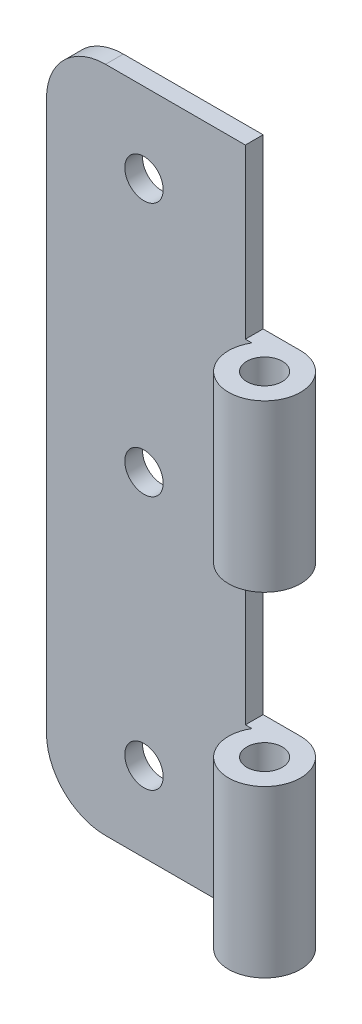
ISO-10303-21;
HEADER;
FILE_DESCRIPTION(('STEP AP214'),'2;1');
FILE_NAME('part.step','',(''),(''),'','','');
FILE_SCHEMA(('AUTOMOTIVE_DESIGN { 1 0 10303 214 1 1 1 1 }'));
ENDSEC;
DATA;
#1=APPLICATION_CONTEXT('core data for automotive mechanical design processes');
#2=APPLICATION_PROTOCOL_DEFINITION('international standard','automotive_design',2000,#1);
#3=PRODUCT_CONTEXT('',#1,'mechanical');
#4=PRODUCT('Part','Part','',(#3));
#5=PRODUCT_RELATED_PRODUCT_CATEGORY('part','',(#4));
#6=PRODUCT_DEFINITION_FORMATION('','',#4);
#7=PRODUCT_DEFINITION_CONTEXT('part definition',#1,'design');
#8=PRODUCT_DEFINITION('design','',#6,#7);
#9=PRODUCT_DEFINITION_SHAPE('','',#8);
#10=(LENGTH_UNIT() NAMED_UNIT(*) SI_UNIT(.MILLI.,.METRE.));
#11=(NAMED_UNIT(*) PLANE_ANGLE_UNIT() SI_UNIT($,.RADIAN.));
#12=(NAMED_UNIT(*) SI_UNIT($,.STERADIAN.) SOLID_ANGLE_UNIT());
#13=UNCERTAINTY_MEASURE_WITH_UNIT(LENGTH_MEASURE(1.E-05),#10,'distance_accuracy_value','');
#14=(GEOMETRIC_REPRESENTATION_CONTEXT(3) GLOBAL_UNCERTAINTY_ASSIGNED_CONTEXT((#13)) GLOBAL_UNIT_ASSIGNED_CONTEXT((#10,
#11,#12)) REPRESENTATION_CONTEXT('',''));
#15=CARTESIAN_POINT('',(0.,0.,0.));
#16=DIRECTION('',(0.,0.,1.));
#17=DIRECTION('',(1.,0.,0.));
#18=AXIS2_PLACEMENT_3D('',#15,#16,#17);
#19=CARTESIAN_POINT('',(0.,-56.5,0.));
#20=DIRECTION('',(0.,1.,0.));
#21=DIRECTION('',(0.,0.,1.));
#22=AXIS2_PLACEMENT_3D('',#19,#20,#21);
#23=CYLINDRICAL_SURFACE('',#22,3.);
#24=CARTESIAN_POINT('',(0.,-28.45,0.));
#25=DIRECTION('',(0.,1.,0.));
#26=DIRECTION('',(0.,0.,1.));
#27=AXIS2_PLACEMENT_3D('',#24,#25,#26);
#28=CIRCLE('',#27,3.);
#29=CARTESIAN_POINT('',(0.,-28.45,3.));
#30=VERTEX_POINT('',#29);
#31=EDGE_CURVE('E184',#30,#30,#28,.T.);
#32=ORIENTED_EDGE('',*,*,#31,.T.);
#33=EDGE_LOOP('',(#32));
#34=FACE_BOUND('',#33,.T.);
#35=CARTESIAN_POINT('',(0.,-56.5,0.));
#36=DIRECTION('',(0.,1.,0.));
#37=DIRECTION('',(0.,0.,1.));
#38=AXIS2_PLACEMENT_3D('',#35,#36,#37);
#39=CIRCLE('',#38,3.);
#40=CARTESIAN_POINT('',(0.,-56.5,3.));
#41=VERTEX_POINT('',#40);
#42=EDGE_CURVE('E192',#41,#41,#39,.F.);
#43=ORIENTED_EDGE('',*,*,#42,.T.);
#44=EDGE_LOOP('',(#43));
#45=FACE_BOUND('',#44,.T.);
#46=ADVANCED_FACE('F16',(#34,#45),#23,.F.);
#47=CARTESIAN_POINT('',(0.,-56.5,0.));
#48=DIRECTION('',(0.,1.,0.));
#49=DIRECTION('',(0.,0.,1.));
#50=AXIS2_PLACEMENT_3D('',#47,#48,#49);
#51=CYLINDRICAL_SURFACE('',#50,3.);
#52=CARTESIAN_POINT('',(0.,28.05,0.));
#53=DIRECTION('',(0.,1.,0.));
#54=DIRECTION('',(0.,0.,1.));
#55=AXIS2_PLACEMENT_3D('',#52,#53,#54);
#56=CIRCLE('',#55,3.);
#57=CARTESIAN_POINT('',(0.,28.05,3.));
#58=VERTEX_POINT('',#57);
#59=EDGE_CURVE('E173',#58,#58,#56,.T.);
#60=ORIENTED_EDGE('',*,*,#59,.T.);
#61=EDGE_LOOP('',(#60));
#62=FACE_BOUND('',#61,.T.);
#63=CARTESIAN_POINT('',(0.,0.,0.));
#64=DIRECTION('',(0.,1.,0.));
#65=DIRECTION('',(0.,0.,1.));
#66=AXIS2_PLACEMENT_3D('',#63,#64,#65);
#67=CIRCLE('',#66,3.);
#68=CARTESIAN_POINT('',(0.,0.,3.));
#69=VERTEX_POINT('',#68);
#70=EDGE_CURVE('E180',#69,#69,#67,.F.);
#71=ORIENTED_EDGE('',*,*,#70,.T.);
#72=EDGE_LOOP('',(#71));
#73=FACE_BOUND('',#72,.T.);
#74=ADVANCED_FACE('F331',(#62,#73),#51,.F.);
#75=CARTESIAN_POINT('',(-30.,46.5,-3.1));
#76=DIRECTION('',(0.,0.,1.));
#77=DIRECTION('',(1.,0.,0.));
#78=AXIS2_PLACEMENT_3D('',#75,#76,#77);
#79=PLANE('',#78);
#80=CARTESIAN_POINT('',(-23.5,0.,-3.1));
#81=DIRECTION('',(0.,0.,-1.));
#82=DIRECTION('',(-1.,0.,0.));
#83=AXIS2_PLACEMENT_3D('',#80,#81,#82);
#84=CIRCLE('',#83,3.25);
#85=CARTESIAN_POINT('',(-26.75,0.,-3.1));
#86=VERTEX_POINT('',#85);
#87=EDGE_CURVE('E168',#86,#86,#84,.T.);
#88=ORIENTED_EDGE('',*,*,#87,.T.);
#89=EDGE_LOOP('',(#88));
#90=FACE_BOUND('',#89,.T.);
#91=CARTESIAN_POINT('',(-23.5,43.,-3.1));
#92=DIRECTION('',(0.,0.,-1.));
#93=DIRECTION('',(-1.,0.,0.));
#94=AXIS2_PLACEMENT_3D('',#91,#92,#93);
#95=CIRCLE('',#94,3.25);
#96=CARTESIAN_POINT('',(-26.75,43.,-3.1));
#97=VERTEX_POINT('',#96);
#98=EDGE_CURVE('E131',#97,#97,#95,.T.);
#99=ORIENTED_EDGE('',*,*,#98,.T.);
#100=EDGE_LOOP('',(#99));
#101=FACE_BOUND('',#100,.T.);
#102=DIRECTION('',(0.,1.,0.));
#103=VECTOR('',#102,1.);
#104=CARTESIAN_POINT('',(-5.25357021462548,-56.5,-3.1));
#105=LINE('',#104,#103);
#106=CARTESIAN_POINT('',(-5.25357021462548,28.05,-3.1));
#107=VERTEX_POINT('',#106);
#108=CARTESIAN_POINT('',(-5.25357021462548,0.,-3.1));
#109=VERTEX_POINT('',#108);
#110=EDGE_CURVE('E140',#107,#109,#105,.F.);
#111=ORIENTED_EDGE('',*,*,#110,.F.);
#112=DIRECTION('',(1.,0.,0.));
#113=VECTOR('',#112,1.);
#114=CARTESIAN_POINT('',(6.1,28.05,-3.10000000000001));
#115=LINE('',#114,#113);
#116=CARTESIAN_POINT('',(-6.35,28.05,-3.10000000000001));
#117=VERTEX_POINT('',#116);
#118=EDGE_CURVE('E176',#107,#117,#115,.F.);
#119=ORIENTED_EDGE('',*,*,#118,.T.);
#120=DIRECTION('',(0.,-1.,0.));
#121=VECTOR('',#120,1.);
#122=CARTESIAN_POINT('',(-6.35,28.05,-3.10000000000001));
#123=LINE('',#122,#121);
#124=CARTESIAN_POINT('',(-6.35,56.5,-3.10000000000001));
#125=VERTEX_POINT('',#124);
#126=EDGE_CURVE('E134',#117,#125,#123,.F.);
#127=ORIENTED_EDGE('',*,*,#126,.T.);
#128=DIRECTION('',(1.,0.,0.));
#129=VECTOR('',#128,1.);
#130=CARTESIAN_POINT('',(0.,56.5,-3.10000000000001));
#131=LINE('',#130,#129);
#132=CARTESIAN_POINT('',(-30.,56.5,-3.1));
#133=VERTEX_POINT('',#132);
#134=EDGE_CURVE('E110',#125,#133,#131,.F.);
#135=ORIENTED_EDGE('',*,*,#134,.T.);
#136=CARTESIAN_POINT('',(-30.,46.5,-3.1));
#137=DIRECTION('',(0.,0.,1.));
#138=DIRECTION('',(1.,0.,0.));
#139=AXIS2_PLACEMENT_3D('',#136,#137,#138);
#140=CIRCLE('',#139,10.);
#141=CARTESIAN_POINT('',(-40.,46.5,-3.1));
#142=VERTEX_POINT('',#141);
#143=EDGE_CURVE('E104',#142,#133,#140,.F.);
#144=ORIENTED_EDGE('',*,*,#143,.F.);
#145=DIRECTION('',(0.,1.,0.));
#146=VECTOR('',#145,1.);
#147=CARTESIAN_POINT('',(-40.,46.5,-3.1));
#148=LINE('',#147,#146);
#149=CARTESIAN_POINT('',(-40.,-46.5,-3.1));
#150=VERTEX_POINT('',#149);
#151=EDGE_CURVE('E108',#142,#150,#148,.F.);
#152=ORIENTED_EDGE('',*,*,#151,.T.);
#153=CARTESIAN_POINT('',(-30.,-46.5,-3.1));
#154=DIRECTION('',(0.,0.,1.));
#155=DIRECTION('',(1.,0.,0.));
#156=AXIS2_PLACEMENT_3D('',#153,#154,#155);
#157=CIRCLE('',#156,10.);
#158=CARTESIAN_POINT('',(-30.,-56.5,-3.1));
#159=VERTEX_POINT('',#158);
#160=EDGE_CURVE('E121',#159,#150,#157,.F.);
#161=ORIENTED_EDGE('',*,*,#160,.F.);
#162=DIRECTION('',(1.,0.,0.));
#163=VECTOR('',#162,1.);
#164=CARTESIAN_POINT('',(6.1,-56.5,-3.1));
#165=LINE('',#164,#163);
#166=CARTESIAN_POINT('',(-5.25357021462548,-56.5,-3.1));
#167=VERTEX_POINT('',#166);
#168=EDGE_CURVE('E191',#159,#167,#165,.T.);
#169=ORIENTED_EDGE('',*,*,#168,.T.);
#170=DIRECTION('',(0.,1.,0.));
#171=VECTOR('',#170,1.);
#172=CARTESIAN_POINT('',(-5.25357021462548,-56.5,-3.1));
#173=LINE('',#172,#171);
#174=CARTESIAN_POINT('',(-5.25357021462548,-28.45,-3.1));
#175=VERTEX_POINT('',#174);
#176=EDGE_CURVE('E151',#175,#167,#173,.F.);
#177=ORIENTED_EDGE('',*,*,#176,.F.);
#178=DIRECTION('',(1.,0.,0.));
#179=VECTOR('',#178,1.);
#180=CARTESIAN_POINT('',(6.1,-28.45,-3.10000000000001));
#181=LINE('',#180,#179);
#182=CARTESIAN_POINT('',(-6.35,-28.45,-3.10000000000001));
#183=VERTEX_POINT('',#182);
#184=EDGE_CURVE('E187',#175,#183,#181,.F.);
#185=ORIENTED_EDGE('',*,*,#184,.T.);
#186=DIRECTION('',(0.,1.,0.));
#187=VECTOR('',#186,1.);
#188=CARTESIAN_POINT('',(-6.35,-28.45,-3.10000000000001));
#189=LINE('',#188,#187);
#190=CARTESIAN_POINT('',(-6.35,0.,-3.10000000000001));
#191=VERTEX_POINT('',#190);
#192=EDGE_CURVE('E145',#183,#191,#189,.T.);
#193=ORIENTED_EDGE('',*,*,#192,.T.);
#194=DIRECTION('',(1.,0.,0.));
#195=VECTOR('',#194,1.);
#196=CARTESIAN_POINT('',(-6.35,0.,-3.10000000000001));
#197=LINE('',#196,#195);
#198=EDGE_CURVE('E183',#191,#109,#197,.T.);
#199=ORIENTED_EDGE('',*,*,#198,.T.);
#200=EDGE_LOOP('',(#111,#119,#127,#135,#144,#152,#161,#169,#177,#185,#193,#199));
#201=FACE_BOUND('',#200,.T.);
#202=CARTESIAN_POINT('',(-23.5,-43.,-3.1));
#203=DIRECTION('',(0.,0.,-1.));
#204=DIRECTION('',(-1.,0.,0.));
#205=AXIS2_PLACEMENT_3D('',#202,#203,#204);
#206=CIRCLE('',#205,3.25);
#207=CARTESIAN_POINT('',(-26.75,-43.,-3.1));
#208=VERTEX_POINT('',#207);
#209=EDGE_CURVE('E19',#208,#208,#206,.T.);
#210=ORIENTED_EDGE('',*,*,#209,.T.);
#211=EDGE_LOOP('',(#210));
#212=FACE_BOUND('',#211,.T.);
#213=ADVANCED_FACE('F106',(#90,#101,#201,#212),#79,.T.);
#214=CARTESIAN_POINT('',(-23.5,-43.,-3.1));
#215=DIRECTION('',(0.,0.,-1.));
#216=DIRECTION('',(-1.,0.,0.));
#217=AXIS2_PLACEMENT_3D('',#214,#215,#216);
#218=CYLINDRICAL_SURFACE('',#217,3.25);
#219=CARTESIAN_POINT('',(-23.5,-43.,-6.1));
#220=DIRECTION('',(0.,0.,-1.));
#221=DIRECTION('',(-1.,0.,0.));
#222=AXIS2_PLACEMENT_3D('',#219,#220,#221);
#223=CIRCLE('',#222,3.25);
#224=CARTESIAN_POINT('',(-26.75,-43.,-6.1));
#225=VERTEX_POINT('',#224);
#226=EDGE_CURVE('E165',#225,#225,#223,.T.);
#227=ORIENTED_EDGE('',*,*,#226,.T.);
#228=EDGE_LOOP('',(#227));
#229=FACE_BOUND('',#228,.T.);
#230=ORIENTED_EDGE('',*,*,#209,.F.);
#231=EDGE_LOOP('',(#230));
#232=FACE_BOUND('',#231,.T.);
#233=ADVANCED_FACE('F330',(#229,#232),#218,.F.);
#234=CARTESIAN_POINT('',(-30.,46.5,-3.1));
#235=DIRECTION('',(0.,0.,1.));
#236=DIRECTION('',(1.,0.,0.));
#237=AXIS2_PLACEMENT_3D('',#234,#235,#236);
#238=CYLINDRICAL_SURFACE('',#237,10.);
#239=ORIENTED_EDGE('',*,*,#143,.T.);
#240=DIRECTION('',(0.,0.,-1.));
#241=VECTOR('',#240,1.);
#242=CARTESIAN_POINT('',(-30.,56.5,0.));
#243=LINE('',#242,#241);
#244=CARTESIAN_POINT('',(-30.,56.5,-6.1));
#245=VERTEX_POINT('',#244);
#246=EDGE_CURVE('E136',#133,#245,#243,.T.);
#247=ORIENTED_EDGE('',*,*,#246,.T.);
#248=CARTESIAN_POINT('',(-30.,46.5,-6.1));
#249=DIRECTION('',(0.,0.,1.));
#250=DIRECTION('',(1.,0.,0.));
#251=AXIS2_PLACEMENT_3D('',#248,#249,#250);
#252=CIRCLE('',#251,10.);
#253=CARTESIAN_POINT('',(-40.,46.5,-6.1));
#254=VERTEX_POINT('',#253);
#255=EDGE_CURVE('E125',#245,#254,#252,.T.);
#256=ORIENTED_EDGE('',*,*,#255,.T.);
#257=DIRECTION('',(0.,0.,-1.));
#258=VECTOR('',#257,1.);
#259=CARTESIAN_POINT('',(-40.,46.5,-3.1));
#260=LINE('',#259,#258);
#261=EDGE_CURVE('E115',#254,#142,#260,.F.);
#262=ORIENTED_EDGE('',*,*,#261,.T.);
#263=EDGE_LOOP('',(#239,#247,#256,#262));
#264=FACE_BOUND('',#263,.T.);
#265=ADVANCED_FACE('F124',(#264),#238,.T.);
#266=CARTESIAN_POINT('',(-40.,46.5,-3.1));
#267=DIRECTION('',(1.,0.,0.));
#268=DIRECTION('',(0.,0.,-1.));
#269=AXIS2_PLACEMENT_3D('',#266,#267,#268);
#270=PLANE('',#269);
#271=DIRECTION('',(0.,0.,1.));
#272=VECTOR('',#271,1.);
#273=CARTESIAN_POINT('',(-40.,-46.5,-3.1));
#274=LINE('',#273,#272);
#275=CARTESIAN_POINT('',(-40.,-46.5,-6.1));
#276=VERTEX_POINT('',#275);
#277=EDGE_CURVE('E120',#150,#276,#274,.F.);
#278=ORIENTED_EDGE('',*,*,#277,.F.);
#279=ORIENTED_EDGE('',*,*,#151,.F.);
#280=ORIENTED_EDGE('',*,*,#261,.F.);
#281=DIRECTION('',(0.,1.,0.));
#282=VECTOR('',#281,1.);
#283=CARTESIAN_POINT('',(-40.,46.5,-6.1));
#284=LINE('',#283,#282);
#285=EDGE_CURVE('E163',#254,#276,#284,.F.);
#286=ORIENTED_EDGE('',*,*,#285,.T.);
#287=EDGE_LOOP('',(#278,#279,#280,#286));
#288=FACE_BOUND('',#287,.T.);
#289=ADVANCED_FACE('F117',(#288),#270,.F.);
#290=CARTESIAN_POINT('',(-30.,-46.5,-3.1));
#291=DIRECTION('',(0.,0.,1.));
#292=DIRECTION('',(1.,0.,0.));
#293=AXIS2_PLACEMENT_3D('',#290,#291,#292);
#294=CYLINDRICAL_SURFACE('',#293,10.);
#295=ORIENTED_EDGE('',*,*,#160,.T.);
#296=ORIENTED_EDGE('',*,*,#277,.T.);
#297=CARTESIAN_POINT('',(-30.,-46.5,-6.1));
#298=DIRECTION('',(0.,0.,1.));
#299=DIRECTION('',(1.,0.,0.));
#300=AXIS2_PLACEMENT_3D('',#297,#298,#299);
#301=CIRCLE('',#300,10.);
#302=CARTESIAN_POINT('',(-30.,-56.5,-6.1));
#303=VERTEX_POINT('',#302);
#304=EDGE_CURVE('E159',#276,#303,#301,.T.);
#305=ORIENTED_EDGE('',*,*,#304,.T.);
#306=DIRECTION('',(0.,0.,1.));
#307=VECTOR('',#306,1.);
#308=CARTESIAN_POINT('',(-30.,-56.5,0.));
#309=LINE('',#308,#307);
#310=EDGE_CURVE('E195',#303,#159,#309,.T.);
#311=ORIENTED_EDGE('',*,*,#310,.T.);
#312=EDGE_LOOP('',(#295,#296,#305,#311));
#313=FACE_BOUND('',#312,.T.);
#314=ADVANCED_FACE('F199',(#313),#294,.T.);
#315=CARTESIAN_POINT('',(6.1,-56.5,0.));
#316=DIRECTION('',(0.,1.,0.));
#317=DIRECTION('',(0.,0.,1.));
#318=AXIS2_PLACEMENT_3D('',#315,#316,#317);
#319=PLANE('',#318);
#320=CARTESIAN_POINT('',(0.,-56.5,0.));
#321=DIRECTION('',(0.,1.,0.));
#322=DIRECTION('',(0.,0.,1.));
#323=AXIS2_PLACEMENT_3D('',#320,#321,#322);
#324=CIRCLE('',#323,6.1);
#325=CARTESIAN_POINT('',(0.,-56.5,-6.1));
#326=VERTEX_POINT('',#325);
#327=EDGE_CURVE('E154',#167,#326,#324,.T.);
#328=ORIENTED_EDGE('',*,*,#327,.F.);
#329=ORIENTED_EDGE('',*,*,#168,.F.);
#330=ORIENTED_EDGE('',*,*,#310,.F.);
#331=DIRECTION('',(1.,0.,0.));
#332=VECTOR('',#331,1.);
#333=CARTESIAN_POINT('',(-30.,-56.5,-6.1));
#334=LINE('',#333,#332);
#335=EDGE_CURVE('E162',#303,#326,#334,.T.);
#336=ORIENTED_EDGE('',*,*,#335,.T.);
#337=EDGE_LOOP('',(#328,#329,#330,#336));
#338=FACE_BOUND('',#337,.T.);
#339=ORIENTED_EDGE('',*,*,#42,.F.);
#340=EDGE_LOOP('',(#339));
#341=FACE_BOUND('',#340,.T.);
#342=ADVANCED_FACE('F270',(#338,#341),#319,.F.);
#343=CARTESIAN_POINT('',(0.,-56.5,0.));
#344=DIRECTION('',(0.,1.,0.));
#345=DIRECTION('',(0.,0.,1.));
#346=AXIS2_PLACEMENT_3D('',#343,#344,#345);
#347=CYLINDRICAL_SURFACE('',#346,6.1);
#348=CARTESIAN_POINT('',(0.,-28.45,0.));
#349=DIRECTION('',(0.,1.,0.));
#350=DIRECTION('',(0.,0.,1.));
#351=AXIS2_PLACEMENT_3D('',#348,#349,#350);
#352=CIRCLE('',#351,6.1);
#353=CARTESIAN_POINT('',(0.,-28.45,-6.1));
#354=VERTEX_POINT('',#353);
#355=EDGE_CURVE('E153',#354,#175,#352,.F.);
#356=ORIENTED_EDGE('',*,*,#355,.T.);
#357=ORIENTED_EDGE('',*,*,#176,.T.);
#358=ORIENTED_EDGE('',*,*,#327,.T.);
#359=DIRECTION('',(0.,1.,0.));
#360=VECTOR('',#359,1.);
#361=CARTESIAN_POINT('',(0.,46.5,-6.1));
#362=LINE('',#361,#360);
#363=EDGE_CURVE('E259',#326,#354,#362,.T.);
#364=ORIENTED_EDGE('',*,*,#363,.T.);
#365=EDGE_LOOP('',(#356,#357,#358,#364));
#366=FACE_BOUND('',#365,.T.);
#367=ADVANCED_FACE('F274',(#366),#347,.T.);
#368=CARTESIAN_POINT('',(6.1,-28.45,113.));
#369=DIRECTION('',(0.,-1.,0.));
#370=DIRECTION('',(1.,0.,0.));
#371=AXIS2_PLACEMENT_3D('',#368,#369,#370);
#372=PLANE('',#371);
#373=ORIENTED_EDGE('',*,*,#31,.F.);
#374=EDGE_LOOP('',(#373));
#375=FACE_BOUND('',#374,.T.);
#376=ORIENTED_EDGE('',*,*,#355,.F.);
#377=DIRECTION('',(1.,0.,0.));
#378=VECTOR('',#377,1.);
#379=CARTESIAN_POINT('',(-30.,-28.45,-6.1));
#380=LINE('',#379,#378);
#381=CARTESIAN_POINT('',(-6.35,-28.45,-6.1));
#382=VERTEX_POINT('',#381);
#383=EDGE_CURVE('E250',#354,#382,#380,.F.);
#384=ORIENTED_EDGE('',*,*,#383,.T.);
#385=DIRECTION('',(0.,0.,1.));
#386=VECTOR('',#385,1.);
#387=CARTESIAN_POINT('',(-6.35,-28.45,113.));
#388=LINE('',#387,#386);
#389=EDGE_CURVE('E148',#382,#183,#388,.T.);
#390=ORIENTED_EDGE('',*,*,#389,.T.);
#391=ORIENTED_EDGE('',*,*,#184,.F.);
#392=EDGE_LOOP('',(#376,#384,#390,#391));
#393=FACE_BOUND('',#392,.T.);
#394=ADVANCED_FACE('F277',(#375,#393),#372,.F.);
#395=CARTESIAN_POINT('',(-6.35,-28.45,113.));
#396=DIRECTION('',(-1.,0.,0.));
#397=DIRECTION('',(0.,0.,1.));
#398=AXIS2_PLACEMENT_3D('',#395,#396,#397);
#399=PLANE('',#398);
#400=ORIENTED_EDGE('',*,*,#389,.F.);
#401=DIRECTION('',(0.,1.,0.));
#402=VECTOR('',#401,1.);
#403=CARTESIAN_POINT('',(-6.35,46.5,-6.1));
#404=LINE('',#403,#402);
#405=CARTESIAN_POINT('',(-6.35,0.,-6.1));
#406=VERTEX_POINT('',#405);
#407=EDGE_CURVE('E238',#382,#406,#404,.T.);
#408=ORIENTED_EDGE('',*,*,#407,.T.);
#409=DIRECTION('',(0.,0.,1.));
#410=VECTOR('',#409,1.);
#411=CARTESIAN_POINT('',(-6.35,0.,113.));
#412=LINE('',#411,#410);
#413=EDGE_CURVE('E147',#406,#191,#412,.T.);
#414=ORIENTED_EDGE('',*,*,#413,.T.);
#415=ORIENTED_EDGE('',*,*,#192,.F.);
#416=EDGE_LOOP('',(#400,#408,#414,#415));
#417=FACE_BOUND('',#416,.T.);
#418=ADVANCED_FACE('F282',(#417),#399,.F.);
#419=CARTESIAN_POINT('',(-6.35,0.,113.));
#420=DIRECTION('',(0.,1.,0.));
#421=DIRECTION('',(0.,0.,1.));
#422=AXIS2_PLACEMENT_3D('',#419,#420,#421);
#423=PLANE('',#422);
#424=ORIENTED_EDGE('',*,*,#70,.F.);
#425=EDGE_LOOP('',(#424));
#426=FACE_BOUND('',#425,.T.);
#427=ORIENTED_EDGE('',*,*,#413,.F.);
#428=DIRECTION('',(1.,0.,0.));
#429=VECTOR('',#428,1.);
#430=CARTESIAN_POINT('',(-30.,0.,-6.1));
#431=LINE('',#430,#429);
#432=CARTESIAN_POINT('',(0.,0.,-6.1));
#433=VERTEX_POINT('',#432);
#434=EDGE_CURVE('E235',#406,#433,#431,.T.);
#435=ORIENTED_EDGE('',*,*,#434,.T.);
#436=CARTESIAN_POINT('',(0.,0.,0.));
#437=DIRECTION('',(0.,1.,0.));
#438=DIRECTION('',(0.,0.,1.));
#439=AXIS2_PLACEMENT_3D('',#436,#437,#438);
#440=CIRCLE('',#439,6.1);
#441=EDGE_CURVE('E144',#109,#433,#440,.T.);
#442=ORIENTED_EDGE('',*,*,#441,.F.);
#443=ORIENTED_EDGE('',*,*,#198,.F.);
#444=EDGE_LOOP('',(#427,#435,#442,#443));
#445=FACE_BOUND('',#444,.T.);
#446=ADVANCED_FACE('F287',(#426,#445),#423,.F.);
#447=CARTESIAN_POINT('',(0.,-56.5,0.));
#448=DIRECTION('',(0.,1.,0.));
#449=DIRECTION('',(0.,0.,1.));
#450=AXIS2_PLACEMENT_3D('',#447,#448,#449);
#451=CYLINDRICAL_SURFACE('',#450,6.1);
#452=CARTESIAN_POINT('',(0.,28.05,0.));
#453=DIRECTION('',(0.,1.,0.));
#454=DIRECTION('',(0.,0.,1.));
#455=AXIS2_PLACEMENT_3D('',#452,#453,#454);
#456=CIRCLE('',#455,6.1);
#457=CARTESIAN_POINT('',(0.,28.05,-6.1));
#458=VERTEX_POINT('',#457);
#459=EDGE_CURVE('E143',#458,#107,#456,.F.);
#460=ORIENTED_EDGE('',*,*,#459,.T.);
#461=ORIENTED_EDGE('',*,*,#110,.T.);
#462=ORIENTED_EDGE('',*,*,#441,.T.);
#463=DIRECTION('',(0.,1.,0.));
#464=VECTOR('',#463,1.);
#465=CARTESIAN_POINT('',(0.,46.5,-6.1));
#466=LINE('',#465,#464);
#467=EDGE_CURVE('E227',#433,#458,#466,.T.);
#468=ORIENTED_EDGE('',*,*,#467,.T.);
#469=EDGE_LOOP('',(#460,#461,#462,#468));
#470=FACE_BOUND('',#469,.T.);
#471=ADVANCED_FACE('F289',(#470),#451,.T.);
#472=CARTESIAN_POINT('',(6.1,28.05,113.));
#473=DIRECTION('',(0.,-1.,0.));
#474=DIRECTION('',(0.,0.,-1.));
#475=AXIS2_PLACEMENT_3D('',#472,#473,#474);
#476=PLANE('',#475);
#477=ORIENTED_EDGE('',*,*,#59,.F.);
#478=EDGE_LOOP('',(#477));
#479=FACE_BOUND('',#478,.T.);
#480=ORIENTED_EDGE('',*,*,#459,.F.);
#481=DIRECTION('',(1.,0.,0.));
#482=VECTOR('',#481,1.);
#483=CARTESIAN_POINT('',(-30.,28.05,-6.1));
#484=LINE('',#483,#482);
#485=CARTESIAN_POINT('',(-6.35,28.05,-6.1));
#486=VERTEX_POINT('',#485);
#487=EDGE_CURVE('E218',#458,#486,#484,.F.);
#488=ORIENTED_EDGE('',*,*,#487,.T.);
#489=DIRECTION('',(0.,0.,1.));
#490=VECTOR('',#489,1.);
#491=CARTESIAN_POINT('',(-6.35,28.05,113.));
#492=LINE('',#491,#490);
#493=EDGE_CURVE('E137',#486,#117,#492,.T.);
#494=ORIENTED_EDGE('',*,*,#493,.T.);
#495=ORIENTED_EDGE('',*,*,#118,.F.);
#496=EDGE_LOOP('',(#480,#488,#494,#495));
#497=FACE_BOUND('',#496,.T.);
#498=ADVANCED_FACE('F292',(#479,#497),#476,.F.);
#499=CARTESIAN_POINT('',(-6.35,28.05,113.));
#500=DIRECTION('',(-1.,0.,0.));
#501=DIRECTION('',(0.,-1.,0.));
#502=AXIS2_PLACEMENT_3D('',#499,#500,#501);
#503=PLANE('',#502);
#504=ORIENTED_EDGE('',*,*,#493,.F.);
#505=DIRECTION('',(0.,1.,0.));
#506=VECTOR('',#505,1.);
#507=CARTESIAN_POINT('',(-6.35,46.5,-6.1));
#508=LINE('',#507,#506);
#509=CARTESIAN_POINT('',(-6.35,56.5,-6.1));
#510=VERTEX_POINT('',#509);
#511=EDGE_CURVE('E215',#486,#510,#508,.T.);
#512=ORIENTED_EDGE('',*,*,#511,.T.);
#513=DIRECTION('',(0.,0.,-1.));
#514=VECTOR('',#513,1.);
#515=CARTESIAN_POINT('',(-6.35,56.5,0.));
#516=LINE('',#515,#514);
#517=EDGE_CURVE('E34',#510,#125,#516,.F.);
#518=ORIENTED_EDGE('',*,*,#517,.T.);
#519=ORIENTED_EDGE('',*,*,#126,.F.);
#520=EDGE_LOOP('',(#504,#512,#518,#519));
#521=FACE_BOUND('',#520,.T.);
#522=ADVANCED_FACE('F296',(#521),#503,.F.);
#523=CARTESIAN_POINT('',(0.,56.5,0.));
#524=DIRECTION('',(0.,-1.,0.));
#525=DIRECTION('',(0.,0.,-1.));
#526=AXIS2_PLACEMENT_3D('',#523,#524,#525);
#527=PLANE('',#526);
#528=ORIENTED_EDGE('',*,*,#517,.F.);
#529=DIRECTION('',(1.,0.,0.));
#530=VECTOR('',#529,1.);
#531=CARTESIAN_POINT('',(-30.,56.5,-6.1));
#532=LINE('',#531,#530);
#533=EDGE_CURVE('E158',#510,#245,#532,.F.);
#534=ORIENTED_EDGE('',*,*,#533,.T.);
#535=ORIENTED_EDGE('',*,*,#246,.F.);
#536=ORIENTED_EDGE('',*,*,#134,.F.);
#537=EDGE_LOOP('',(#528,#534,#535,#536));
#538=FACE_BOUND('',#537,.T.);
#539=ADVANCED_FACE('F298',(#538),#527,.F.);
#540=CARTESIAN_POINT('',(-23.5,43.,-3.1));
#541=DIRECTION('',(0.,0.,-1.));
#542=DIRECTION('',(-1.,0.,0.));
#543=AXIS2_PLACEMENT_3D('',#540,#541,#542);
#544=CYLINDRICAL_SURFACE('',#543,3.25);
#545=CARTESIAN_POINT('',(-23.5,43.,-6.1));
#546=DIRECTION('',(0.,0.,-1.));
#547=DIRECTION('',(-1.,0.,0.));
#548=AXIS2_PLACEMENT_3D('',#545,#546,#547);
#549=CIRCLE('',#548,3.25);
#550=CARTESIAN_POINT('',(-26.75,43.,-6.1));
#551=VERTEX_POINT('',#550);
#552=EDGE_CURVE('E25',#551,#551,#549,.T.);
#553=ORIENTED_EDGE('',*,*,#552,.T.);
#554=EDGE_LOOP('',(#553));
#555=FACE_BOUND('',#554,.T.);
#556=ORIENTED_EDGE('',*,*,#98,.F.);
#557=EDGE_LOOP('',(#556));
#558=FACE_BOUND('',#557,.T.);
#559=ADVANCED_FACE('F305',(#555,#558),#544,.F.);
#560=CARTESIAN_POINT('',(-23.5,0.,-3.1));
#561=DIRECTION('',(0.,0.,-1.));
#562=DIRECTION('',(-1.,0.,0.));
#563=AXIS2_PLACEMENT_3D('',#560,#561,#562);
#564=CYLINDRICAL_SURFACE('',#563,3.25);
#565=CARTESIAN_POINT('',(-23.5,0.,-6.1));
#566=DIRECTION('',(0.,0.,-1.));
#567=DIRECTION('',(-1.,0.,0.));
#568=AXIS2_PLACEMENT_3D('',#565,#566,#567);
#569=CIRCLE('',#568,3.25);
#570=CARTESIAN_POINT('',(-26.75,0.,-6.1));
#571=VERTEX_POINT('',#570);
#572=EDGE_CURVE('E10',#571,#571,#569,.T.);
#573=ORIENTED_EDGE('',*,*,#572,.T.);
#574=EDGE_LOOP('',(#573));
#575=FACE_BOUND('',#574,.T.);
#576=ORIENTED_EDGE('',*,*,#87,.F.);
#577=EDGE_LOOP('',(#576));
#578=FACE_BOUND('',#577,.T.);
#579=ADVANCED_FACE('F310',(#575,#578),#564,.F.);
#580=CARTESIAN_POINT('',(-30.,46.5,-6.1));
#581=DIRECTION('',(0.,0.,1.));
#582=DIRECTION('',(1.,0.,0.));
#583=AXIS2_PLACEMENT_3D('',#580,#581,#582);
#584=PLANE('',#583);
#585=ORIENTED_EDGE('',*,*,#572,.F.);
#586=EDGE_LOOP('',(#585));
#587=FACE_BOUND('',#586,.T.);
#588=ORIENTED_EDGE('',*,*,#552,.F.);
#589=EDGE_LOOP('',(#588));
#590=FACE_BOUND('',#589,.T.);
#591=ORIENTED_EDGE('',*,*,#511,.F.);
#592=ORIENTED_EDGE('',*,*,#487,.F.);
#593=ORIENTED_EDGE('',*,*,#467,.F.);
#594=ORIENTED_EDGE('',*,*,#434,.F.);
#595=ORIENTED_EDGE('',*,*,#407,.F.);
#596=ORIENTED_EDGE('',*,*,#383,.F.);
#597=ORIENTED_EDGE('',*,*,#363,.F.);
#598=ORIENTED_EDGE('',*,*,#335,.F.);
#599=ORIENTED_EDGE('',*,*,#304,.F.);
#600=ORIENTED_EDGE('',*,*,#285,.F.);
#601=ORIENTED_EDGE('',*,*,#255,.F.);
#602=ORIENTED_EDGE('',*,*,#533,.F.);
#603=EDGE_LOOP('',(#591,#592,#593,#594,#595,#596,#597,#598,#599,#600,#601,#602));
#604=FACE_BOUND('',#603,.T.);
#605=ORIENTED_EDGE('',*,*,#226,.F.);
#606=EDGE_LOOP('',(#605));
#607=FACE_BOUND('',#606,.T.);
#608=ADVANCED_FACE('F203',(#587,#590,#604,#607),#584,.F.);
#609=CLOSED_SHELL('',(#46,#74,#213,#233,#265,#289,#314,#342,#367,#394,#418,#446,#471,#498,#522,
#539,#559,#579,#608));
#610=MANIFOLD_SOLID_BREP('B1',#609);
#611=ADVANCED_BREP_SHAPE_REPRESENTATION('',(#18,#610),#14);
#612=SHAPE_DEFINITION_REPRESENTATION(#9,#611);
ENDSEC;
END-ISO-10303-21;
